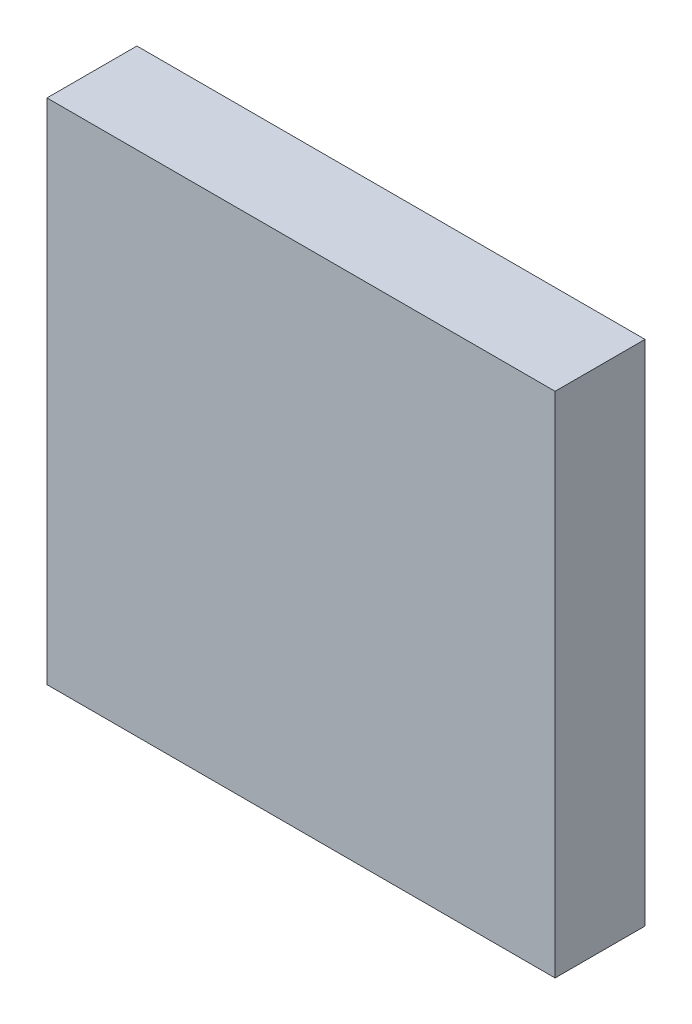
ISO-10303-21;
HEADER;
FILE_DESCRIPTION(('STEP AP214'),'2;1');
FILE_NAME('part.step','',(''),(''),'','','');
FILE_SCHEMA(('AUTOMOTIVE_DESIGN { 1 0 10303 214 1 1 1 1 }'));
ENDSEC;
DATA;
#1=APPLICATION_CONTEXT('core data for automotive mechanical design processes');
#2=APPLICATION_PROTOCOL_DEFINITION('international standard','automotive_design',2000,#1);
#3=PRODUCT_CONTEXT('',#1,'mechanical');
#4=PRODUCT('Part','Part','',(#3));
#5=PRODUCT_RELATED_PRODUCT_CATEGORY('part','',(#4));
#6=PRODUCT_DEFINITION_FORMATION('','',#4);
#7=PRODUCT_DEFINITION_CONTEXT('part definition',#1,'design');
#8=PRODUCT_DEFINITION('design','',#6,#7);
#9=PRODUCT_DEFINITION_SHAPE('','',#8);
#10=(LENGTH_UNIT() NAMED_UNIT(*) SI_UNIT(.MILLI.,.METRE.));
#11=(NAMED_UNIT(*) PLANE_ANGLE_UNIT() SI_UNIT($,.RADIAN.));
#12=(NAMED_UNIT(*) SI_UNIT($,.STERADIAN.) SOLID_ANGLE_UNIT());
#13=UNCERTAINTY_MEASURE_WITH_UNIT(LENGTH_MEASURE(1.E-05),#10,'distance_accuracy_value','');
#14=(GEOMETRIC_REPRESENTATION_CONTEXT(3) GLOBAL_UNCERTAINTY_ASSIGNED_CONTEXT((#13)) GLOBAL_UNIT_ASSIGNED_CONTEXT((#10,
#11,#12)) REPRESENTATION_CONTEXT('',''));
#15=CARTESIAN_POINT('',(0.,0.,0.));
#16=DIRECTION('',(0.,0.,1.));
#17=DIRECTION('',(1.,0.,0.));
#18=AXIS2_PLACEMENT_3D('',#15,#16,#17);
#19=CARTESIAN_POINT('',(56.5,-56.5,20.));
#20=DIRECTION('',(-1.,0.,0.));
#21=DIRECTION('',(0.,0.,1.));
#22=AXIS2_PLACEMENT_3D('',#19,#20,#21);
#23=PLANE('',#22);
#24=DIRECTION('',(0.,1.,0.));
#25=VECTOR('',#24,1.);
#26=CARTESIAN_POINT('',(56.5,-56.5,0.));
#27=LINE('',#26,#25);
#28=CARTESIAN_POINT('',(56.5,-56.5,0.));
#29=VERTEX_POINT('',#28);
#30=CARTESIAN_POINT('',(56.5,56.5,0.));
#31=VERTEX_POINT('',#30);
#32=EDGE_CURVE('E96',#29,#31,#27,.T.);
#33=ORIENTED_EDGE('',*,*,#32,.T.);
#34=DIRECTION('',(0.,0.,-1.));
#35=VECTOR('',#34,1.);
#36=CARTESIAN_POINT('',(56.5,56.5,20.));
#37=LINE('',#36,#35);
#38=CARTESIAN_POINT('',(56.5,56.5,20.));
#39=VERTEX_POINT('',#38);
#40=EDGE_CURVE('E11',#39,#31,#37,.T.);
#41=ORIENTED_EDGE('',*,*,#40,.F.);
#42=DIRECTION('',(0.,1.,0.));
#43=VECTOR('',#42,1.);
#44=CARTESIAN_POINT('',(56.5,-56.5,20.));
#45=LINE('',#44,#43);
#46=CARTESIAN_POINT('',(56.5,-56.5,20.));
#47=VERTEX_POINT('',#46);
#48=EDGE_CURVE('E84',#47,#39,#45,.T.);
#49=ORIENTED_EDGE('',*,*,#48,.F.);
#50=DIRECTION('',(0.,0.,-1.));
#51=VECTOR('',#50,1.);
#52=CARTESIAN_POINT('',(56.5,-56.5,20.));
#53=LINE('',#52,#51);
#54=EDGE_CURVE('E92',#47,#29,#53,.T.);
#55=ORIENTED_EDGE('',*,*,#54,.T.);
#56=EDGE_LOOP('',(#33,#41,#49,#55));
#57=FACE_BOUND('',#56,.T.);
#58=ADVANCED_FACE('F33',(#57),#23,.F.);
#59=CARTESIAN_POINT('',(-56.5,56.5,20.));
#60=DIRECTION('',(0.,-1.,0.));
#61=DIRECTION('',(0.,0.,-1.));
#62=AXIS2_PLACEMENT_3D('',#59,#60,#61);
#63=PLANE('',#62);
#64=DIRECTION('',(-1.,0.,0.));
#65=VECTOR('',#64,1.);
#66=CARTESIAN_POINT('',(-56.5,56.5,0.));
#67=LINE('',#66,#65);
#68=CARTESIAN_POINT('',(-56.5,56.5,0.));
#69=VERTEX_POINT('',#68);
#70=EDGE_CURVE('E88',#31,#69,#67,.T.);
#71=ORIENTED_EDGE('',*,*,#70,.T.);
#72=DIRECTION('',(0.,0.,-1.));
#73=VECTOR('',#72,1.);
#74=CARTESIAN_POINT('',(-56.5,56.5,20.));
#75=LINE('',#74,#73);
#76=CARTESIAN_POINT('',(-56.5,56.5,20.));
#77=VERTEX_POINT('',#76);
#78=EDGE_CURVE('E41',#77,#69,#75,.T.);
#79=ORIENTED_EDGE('',*,*,#78,.F.);
#80=DIRECTION('',(-1.,0.,0.));
#81=VECTOR('',#80,1.);
#82=CARTESIAN_POINT('',(-56.5,56.5,20.));
#83=LINE('',#82,#81);
#84=EDGE_CURVE('E79',#39,#77,#83,.T.);
#85=ORIENTED_EDGE('',*,*,#84,.F.);
#86=ORIENTED_EDGE('',*,*,#40,.T.);
#87=EDGE_LOOP('',(#71,#79,#85,#86));
#88=FACE_BOUND('',#87,.T.);
#89=ADVANCED_FACE('F87',(#88),#63,.F.);
#90=CARTESIAN_POINT('',(-56.5,-56.5,20.));
#91=DIRECTION('',(1.,0.,0.));
#92=DIRECTION('',(0.,0.,-1.));
#93=AXIS2_PLACEMENT_3D('',#90,#91,#92);
#94=PLANE('',#93);
#95=DIRECTION('',(0.,-1.,0.));
#96=VECTOR('',#95,1.);
#97=CARTESIAN_POINT('',(-56.5,-56.5,0.));
#98=LINE('',#97,#96);
#99=CARTESIAN_POINT('',(-56.5,-56.5,0.));
#100=VERTEX_POINT('',#99);
#101=EDGE_CURVE('E66',#69,#100,#98,.T.);
#102=ORIENTED_EDGE('',*,*,#101,.T.);
#103=DIRECTION('',(0.,0.,-1.));
#104=VECTOR('',#103,1.);
#105=CARTESIAN_POINT('',(-56.5,-56.5,20.));
#106=LINE('',#105,#104);
#107=CARTESIAN_POINT('',(-56.5,-56.5,20.));
#108=VERTEX_POINT('',#107);
#109=EDGE_CURVE('E89',#108,#100,#106,.T.);
#110=ORIENTED_EDGE('',*,*,#109,.F.);
#111=DIRECTION('',(0.,-1.,0.));
#112=VECTOR('',#111,1.);
#113=CARTESIAN_POINT('',(-56.5,-56.5,20.));
#114=LINE('',#113,#112);
#115=EDGE_CURVE('E82',#77,#108,#114,.T.);
#116=ORIENTED_EDGE('',*,*,#115,.F.);
#117=ORIENTED_EDGE('',*,*,#78,.T.);
#118=EDGE_LOOP('',(#102,#110,#116,#117));
#119=FACE_BOUND('',#118,.T.);
#120=ADVANCED_FACE('F90',(#119),#94,.F.);
#121=CARTESIAN_POINT('',(-56.5,-56.5,20.));
#122=DIRECTION('',(0.,1.,0.));
#123=DIRECTION('',(0.,0.,1.));
#124=AXIS2_PLACEMENT_3D('',#121,#122,#123);
#125=PLANE('',#124);
#126=DIRECTION('',(1.,0.,0.));
#127=VECTOR('',#126,1.);
#128=CARTESIAN_POINT('',(-56.5,-56.5,0.));
#129=LINE('',#128,#127);
#130=EDGE_CURVE('E72',#100,#29,#129,.T.);
#131=ORIENTED_EDGE('',*,*,#130,.T.);
#132=ORIENTED_EDGE('',*,*,#54,.F.);
#133=DIRECTION('',(1.,0.,0.));
#134=VECTOR('',#133,1.);
#135=CARTESIAN_POINT('',(-56.5,-56.5,20.));
#136=LINE('',#135,#134);
#137=EDGE_CURVE('E49',#108,#47,#136,.T.);
#138=ORIENTED_EDGE('',*,*,#137,.F.);
#139=ORIENTED_EDGE('',*,*,#109,.T.);
#140=EDGE_LOOP('',(#131,#132,#138,#139));
#141=FACE_BOUND('',#140,.T.);
#142=ADVANCED_FACE('F103',(#141),#125,.F.);
#143=CARTESIAN_POINT('',(0.,0.,20.));
#144=DIRECTION('',(0.,0.,-1.));
#145=DIRECTION('',(-1.,0.,0.));
#146=AXIS2_PLACEMENT_3D('',#143,#144,#145);
#147=PLANE('',#146);
#148=ORIENTED_EDGE('',*,*,#48,.T.);
#149=ORIENTED_EDGE('',*,*,#84,.T.);
#150=ORIENTED_EDGE('',*,*,#115,.T.);
#151=ORIENTED_EDGE('',*,*,#137,.T.);
#152=EDGE_LOOP('',(#148,#149,#150,#151));
#153=FACE_BOUND('',#152,.T.);
#154=ADVANCED_FACE('F80',(#153),#147,.F.);
#155=CARTESIAN_POINT('',(0.,0.,0.));
#156=DIRECTION('',(0.,0.,-1.));
#157=DIRECTION('',(-1.,0.,0.));
#158=AXIS2_PLACEMENT_3D('',#155,#156,#157);
#159=PLANE('',#158);
#160=ORIENTED_EDGE('',*,*,#32,.F.);
#161=ORIENTED_EDGE('',*,*,#130,.F.);
#162=ORIENTED_EDGE('',*,*,#101,.F.);
#163=ORIENTED_EDGE('',*,*,#70,.F.);
#164=EDGE_LOOP('',(#160,#161,#162,#163));
#165=FACE_BOUND('',#164,.T.);
#166=ADVANCED_FACE('F106',(#165),#159,.T.);
#167=CLOSED_SHELL('',(#58,#89,#120,#142,#154,#166));
#168=MANIFOLD_SOLID_BREP('B2',#167);
#169=ADVANCED_BREP_SHAPE_REPRESENTATION('',(#18,#168),#14);
#170=SHAPE_DEFINITION_REPRESENTATION(#9,#169);
ENDSEC;
END-ISO-10303-21;
